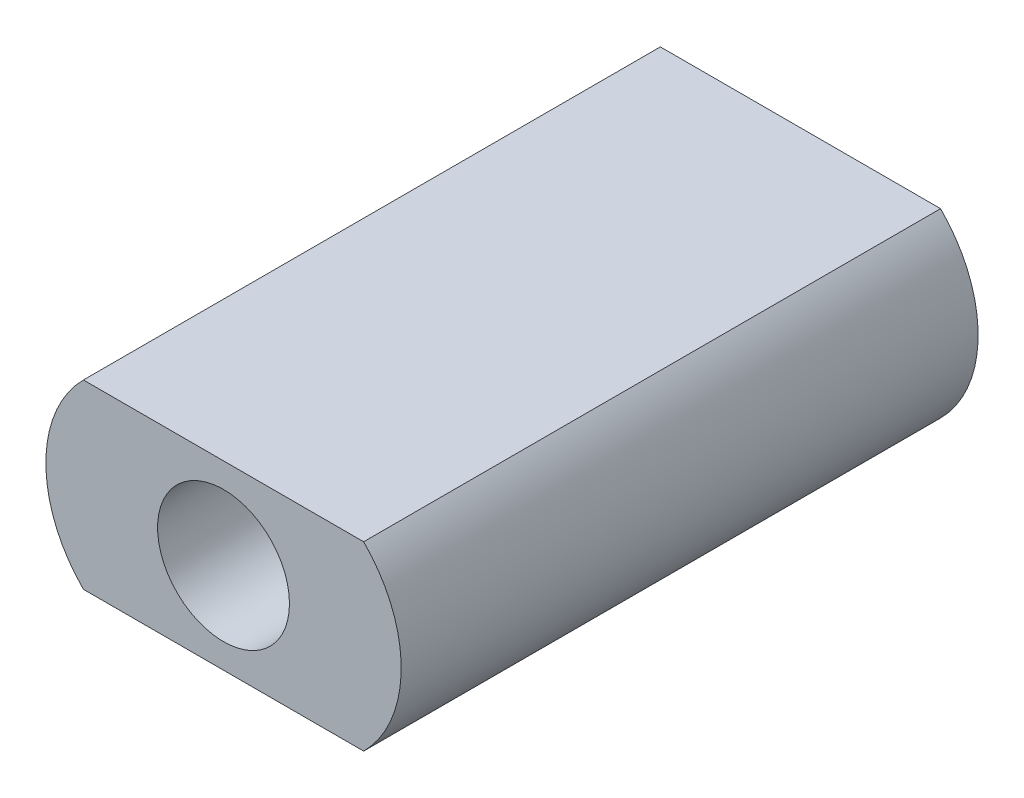
ISO-10303-21;
HEADER;
FILE_DESCRIPTION(('STEP AP214'),'2;1');
FILE_NAME('part.step','',(''),(''),'','','');
FILE_SCHEMA(('AUTOMOTIVE_DESIGN { 1 0 10303 214 1 1 1 1 }'));
ENDSEC;
DATA;
#1=APPLICATION_CONTEXT('core data for automotive mechanical design processes');
#2=APPLICATION_PROTOCOL_DEFINITION('international standard','automotive_design',2000,#1);
#3=PRODUCT_CONTEXT('',#1,'mechanical');
#4=PRODUCT('Part','Part','',(#3));
#5=PRODUCT_RELATED_PRODUCT_CATEGORY('part','',(#4));
#6=PRODUCT_DEFINITION_FORMATION('','',#4);
#7=PRODUCT_DEFINITION_CONTEXT('part definition',#1,'design');
#8=PRODUCT_DEFINITION('design','',#6,#7);
#9=PRODUCT_DEFINITION_SHAPE('','',#8);
#10=(LENGTH_UNIT() NAMED_UNIT(*) SI_UNIT(.MILLI.,.METRE.));
#11=(NAMED_UNIT(*) PLANE_ANGLE_UNIT() SI_UNIT($,.RADIAN.));
#12=(NAMED_UNIT(*) SI_UNIT($,.STERADIAN.) SOLID_ANGLE_UNIT());
#13=UNCERTAINTY_MEASURE_WITH_UNIT(LENGTH_MEASURE(1.E-05),#10,'distance_accuracy_value','');
#14=(GEOMETRIC_REPRESENTATION_CONTEXT(3) GLOBAL_UNCERTAINTY_ASSIGNED_CONTEXT((#13)) GLOBAL_UNIT_ASSIGNED_CONTEXT((#10,
#11,#12)) REPRESENTATION_CONTEXT('',''));
#15=CARTESIAN_POINT('',(0.,0.,0.));
#16=DIRECTION('',(0.,0.,1.));
#17=DIRECTION('',(1.,0.,0.));
#18=AXIS2_PLACEMENT_3D('',#15,#16,#17);
#19=CARTESIAN_POINT('',(0.,0.,-2.5));
#20=DIRECTION('',(0.,0.,1.));
#21=DIRECTION('',(1.,0.,0.));
#22=AXIS2_PLACEMENT_3D('',#19,#20,#21);
#23=PLANE('',#22);
#24=CARTESIAN_POINT('',(0.,0.,-2.5));
#25=DIRECTION('',(0.,0.,1.));
#26=DIRECTION('',(1.,0.,0.));
#27=AXIS2_PLACEMENT_3D('',#24,#25,#26);
#28=CIRCLE('',#27,4.);
#29=CARTESIAN_POINT('',(4.,0.,-2.5));
#30=VERTEX_POINT('',#29);
#31=EDGE_CURVE('E20',#30,#30,#28,.T.);
#32=ORIENTED_EDGE('',*,*,#31,.T.);
#33=EDGE_LOOP('',(#32));
#34=FACE_BOUND('',#33,.T.);
#35=ADVANCED_FACE('F17',(#34),#23,.T.);
#36=CARTESIAN_POINT('',(0.,0.,-2.5));
#37=DIRECTION('',(0.,0.,1.));
#38=DIRECTION('',(1.,0.,0.));
#39=AXIS2_PLACEMENT_3D('',#36,#37,#38);
#40=CYLINDRICAL_SURFACE('',#39,4.);
#41=CARTESIAN_POINT('',(0.,0.,17.5));
#42=DIRECTION('',(0.,0.,1.));
#43=DIRECTION('',(1.,0.,0.));
#44=AXIS2_PLACEMENT_3D('',#41,#42,#43);
#45=CIRCLE('',#44,4.);
#46=CARTESIAN_POINT('',(4.,0.,17.5));
#47=VERTEX_POINT('',#46);
#48=EDGE_CURVE('E67',#47,#47,#45,.F.);
#49=ORIENTED_EDGE('',*,*,#48,.F.);
#50=EDGE_LOOP('',(#49));
#51=FACE_BOUND('',#50,.T.);
#52=ORIENTED_EDGE('',*,*,#31,.F.);
#53=EDGE_LOOP('',(#52));
#54=FACE_BOUND('',#53,.T.);
#55=ADVANCED_FACE('F94',(#51,#54),#40,.F.);
#56=CARTESIAN_POINT('',(8.5,5.5,17.5));
#57=DIRECTION('',(0.,-1.,0.));
#58=DIRECTION('',(1.,0.,0.));
#59=AXIS2_PLACEMENT_3D('',#56,#57,#58);
#60=PLANE('',#59);
#61=DIRECTION('',(0.,0.,-1.));
#62=VECTOR('',#61,1.);
#63=CARTESIAN_POINT('',(-8.5,5.5,17.5));
#64=LINE('',#63,#62);
#65=CARTESIAN_POINT('',(-8.5,5.5,17.5));
#66=VERTEX_POINT('',#65);
#67=CARTESIAN_POINT('',(-8.5,5.5,-17.5));
#68=VERTEX_POINT('',#67);
#69=EDGE_CURVE('E86',#66,#68,#64,.T.);
#70=ORIENTED_EDGE('',*,*,#69,.F.);
#71=DIRECTION('',(1.,0.,0.));
#72=VECTOR('',#71,1.);
#73=CARTESIAN_POINT('',(-2.99999999999999,5.5,17.5));
#74=LINE('',#73,#72);
#75=CARTESIAN_POINT('',(8.5,5.5,17.5));
#76=VERTEX_POINT('',#75);
#77=EDGE_CURVE('E62',#76,#66,#74,.F.);
#78=ORIENTED_EDGE('',*,*,#77,.F.);
#79=DIRECTION('',(0.,0.,-1.));
#80=VECTOR('',#79,1.);
#81=CARTESIAN_POINT('',(8.5,5.5,17.5));
#82=LINE('',#81,#80);
#83=CARTESIAN_POINT('',(8.5,5.5,-17.5));
#84=VERTEX_POINT('',#83);
#85=EDGE_CURVE('E85',#84,#76,#82,.F.);
#86=ORIENTED_EDGE('',*,*,#85,.F.);
#87=DIRECTION('',(1.,0.,0.));
#88=VECTOR('',#87,1.);
#89=CARTESIAN_POINT('',(-2.99999999999999,5.5,-17.5));
#90=LINE('',#89,#88);
#91=EDGE_CURVE('E80',#84,#68,#90,.F.);
#92=ORIENTED_EDGE('',*,*,#91,.T.);
#93=EDGE_LOOP('',(#70,#78,#86,#92));
#94=FACE_BOUND('',#93,.T.);
#95=ADVANCED_FACE('F97',(#94),#60,.F.);
#96=CARTESIAN_POINT('',(-2.99999999999999,0.,17.5));
#97=DIRECTION('',(0.,0.,-1.));
#98=DIRECTION('',(-1.,0.,0.));
#99=AXIS2_PLACEMENT_3D('',#96,#97,#98);
#100=CYLINDRICAL_SURFACE('',#99,7.77817459305203);
#101=CARTESIAN_POINT('',(-2.99999999999999,0.,-17.5));
#102=DIRECTION('',(0.,0.,-1.));
#103=DIRECTION('',(-1.,0.,0.));
#104=AXIS2_PLACEMENT_3D('',#101,#102,#103);
#105=CIRCLE('',#104,7.77817459305203);
#106=CARTESIAN_POINT('',(-8.5,-5.5,-17.5));
#107=VERTEX_POINT('',#106);
#108=EDGE_CURVE('E78',#68,#107,#105,.F.);
#109=ORIENTED_EDGE('',*,*,#108,.T.);
#110=DIRECTION('',(0.,0.,1.));
#111=VECTOR('',#110,1.);
#112=CARTESIAN_POINT('',(-8.5,-5.5,17.5));
#113=LINE('',#112,#111);
#114=CARTESIAN_POINT('',(-8.5,-5.5,17.5));
#115=VERTEX_POINT('',#114);
#116=EDGE_CURVE('E73',#107,#115,#113,.T.);
#117=ORIENTED_EDGE('',*,*,#116,.T.);
#118=CARTESIAN_POINT('',(-2.99999999999999,0.,17.5));
#119=DIRECTION('',(0.,0.,-1.));
#120=DIRECTION('',(-1.,0.,0.));
#121=AXIS2_PLACEMENT_3D('',#118,#119,#120);
#122=CIRCLE('',#121,7.77817459305203);
#123=EDGE_CURVE('E55',#66,#115,#122,.F.);
#124=ORIENTED_EDGE('',*,*,#123,.F.);
#125=ORIENTED_EDGE('',*,*,#69,.T.);
#126=EDGE_LOOP('',(#109,#117,#124,#125));
#127=FACE_BOUND('',#126,.T.);
#128=ADVANCED_FACE('F76',(#127),#100,.T.);
#129=CARTESIAN_POINT('',(-2.99999999999999,0.,17.5));
#130=DIRECTION('',(0.,0.,1.));
#131=DIRECTION('',(1.,0.,0.));
#132=AXIS2_PLACEMENT_3D('',#129,#130,#131);
#133=PLANE('',#132);
#134=CARTESIAN_POINT('',(2.99999999999999,0.,17.5));
#135=DIRECTION('',(0.,0.,-1.));
#136=DIRECTION('',(-1.,0.,0.));
#137=AXIS2_PLACEMENT_3D('',#134,#135,#136);
#138=CIRCLE('',#137,7.77817459305203);
#139=CARTESIAN_POINT('',(8.5,-5.5,17.5));
#140=VERTEX_POINT('',#139);
#141=EDGE_CURVE('E88',#76,#140,#138,.T.);
#142=ORIENTED_EDGE('',*,*,#141,.F.);
#143=ORIENTED_EDGE('',*,*,#77,.T.);
#144=ORIENTED_EDGE('',*,*,#123,.T.);
#145=DIRECTION('',(-1.,0.,0.));
#146=VECTOR('',#145,1.);
#147=CARTESIAN_POINT('',(8.5,-5.5,17.5));
#148=LINE('',#147,#146);
#149=EDGE_CURVE('E60',#115,#140,#148,.F.);
#150=ORIENTED_EDGE('',*,*,#149,.T.);
#151=EDGE_LOOP('',(#142,#143,#144,#150));
#152=FACE_BOUND('',#151,.T.);
#153=ORIENTED_EDGE('',*,*,#48,.T.);
#154=EDGE_LOOP('',(#153));
#155=FACE_BOUND('',#154,.T.);
#156=ADVANCED_FACE('F58',(#152,#155),#133,.T.);
#157=CARTESIAN_POINT('',(2.99999999999999,0.,17.5));
#158=DIRECTION('',(0.,0.,-1.));
#159=DIRECTION('',(-1.,0.,0.));
#160=AXIS2_PLACEMENT_3D('',#157,#158,#159);
#161=CYLINDRICAL_SURFACE('',#160,7.77817459305203);
#162=ORIENTED_EDGE('',*,*,#141,.T.);
#163=DIRECTION('',(0.,0.,1.));
#164=VECTOR('',#163,1.);
#165=CARTESIAN_POINT('',(8.5,-5.5,17.5));
#166=LINE('',#165,#164);
#167=CARTESIAN_POINT('',(8.5,-5.5,-17.5));
#168=VERTEX_POINT('',#167);
#169=EDGE_CURVE('E26',#140,#168,#166,.F.);
#170=ORIENTED_EDGE('',*,*,#169,.T.);
#171=CARTESIAN_POINT('',(2.99999999999999,0.,-17.5));
#172=DIRECTION('',(0.,0.,-1.));
#173=DIRECTION('',(-1.,0.,0.));
#174=AXIS2_PLACEMENT_3D('',#171,#172,#173);
#175=CIRCLE('',#174,7.77817459305203);
#176=EDGE_CURVE('E34',#168,#84,#175,.F.);
#177=ORIENTED_EDGE('',*,*,#176,.T.);
#178=ORIENTED_EDGE('',*,*,#85,.T.);
#179=EDGE_LOOP('',(#162,#170,#177,#178));
#180=FACE_BOUND('',#179,.T.);
#181=ADVANCED_FACE('F111',(#180),#161,.T.);
#182=CARTESIAN_POINT('',(-2.99999999999999,0.,-17.5));
#183=DIRECTION('',(0.,0.,1.));
#184=DIRECTION('',(1.,0.,0.));
#185=AXIS2_PLACEMENT_3D('',#182,#183,#184);
#186=PLANE('',#185);
#187=ORIENTED_EDGE('',*,*,#91,.F.);
#188=ORIENTED_EDGE('',*,*,#176,.F.);
#189=DIRECTION('',(-1.,0.,0.));
#190=VECTOR('',#189,1.);
#191=CARTESIAN_POINT('',(8.5,-5.5,-17.5));
#192=LINE('',#191,#190);
#193=EDGE_CURVE('E11',#168,#107,#192,.T.);
#194=ORIENTED_EDGE('',*,*,#193,.T.);
#195=ORIENTED_EDGE('',*,*,#108,.F.);
#196=EDGE_LOOP('',(#187,#188,#194,#195));
#197=FACE_BOUND('',#196,.T.);
#198=ADVANCED_FACE('F106',(#197),#186,.F.);
#199=CARTESIAN_POINT('',(8.5,-5.5,17.5));
#200=DIRECTION('',(0.,1.,0.));
#201=DIRECTION('',(-1.,0.,0.));
#202=AXIS2_PLACEMENT_3D('',#199,#200,#201);
#203=PLANE('',#202);
#204=ORIENTED_EDGE('',*,*,#169,.F.);
#205=ORIENTED_EDGE('',*,*,#149,.F.);
#206=ORIENTED_EDGE('',*,*,#116,.F.);
#207=ORIENTED_EDGE('',*,*,#193,.F.);
#208=EDGE_LOOP('',(#204,#205,#206,#207));
#209=FACE_BOUND('',#208,.T.);
#210=ADVANCED_FACE('F72',(#209),#203,.F.);
#211=CLOSED_SHELL('',(#35,#55,#95,#128,#156,#181,#198,#210));
#212=MANIFOLD_SOLID_BREP('B1',#211);
#213=ADVANCED_BREP_SHAPE_REPRESENTATION('',(#18,#212),#14);
#214=SHAPE_DEFINITION_REPRESENTATION(#9,#213);
ENDSEC;
END-ISO-10303-21;
